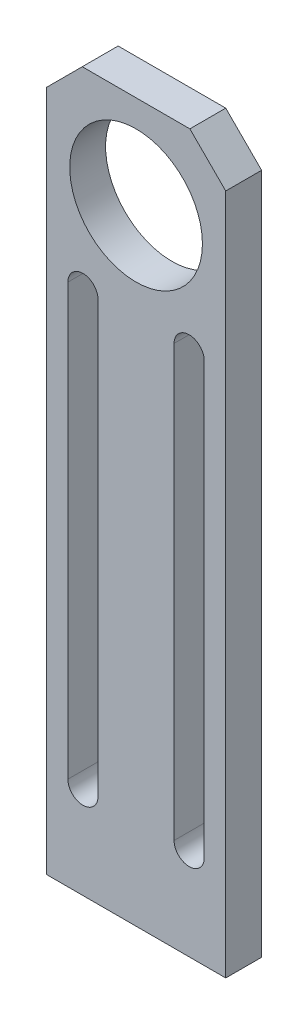
ISO-10303-21;
HEADER;
FILE_DESCRIPTION(('STEP AP214'),'2;1');
FILE_NAME('part.step','',(''),(''),'','','');
FILE_SCHEMA(('AUTOMOTIVE_DESIGN { 1 0 10303 214 1 1 1 1 }'));
ENDSEC;
DATA;
#1=APPLICATION_CONTEXT('core data for automotive mechanical design processes');
#2=APPLICATION_PROTOCOL_DEFINITION('international standard','automotive_design',2000,#1);
#3=PRODUCT_CONTEXT('',#1,'mechanical');
#4=PRODUCT('Part','Part','',(#3));
#5=PRODUCT_RELATED_PRODUCT_CATEGORY('part','',(#4));
#6=PRODUCT_DEFINITION_FORMATION('','',#4);
#7=PRODUCT_DEFINITION_CONTEXT('part definition',#1,'design');
#8=PRODUCT_DEFINITION('design','',#6,#7);
#9=PRODUCT_DEFINITION_SHAPE('','',#8);
#10=(LENGTH_UNIT() NAMED_UNIT(*) SI_UNIT(.MILLI.,.METRE.));
#11=(NAMED_UNIT(*) PLANE_ANGLE_UNIT() SI_UNIT($,.RADIAN.));
#12=(NAMED_UNIT(*) SI_UNIT($,.STERADIAN.) SOLID_ANGLE_UNIT());
#13=UNCERTAINTY_MEASURE_WITH_UNIT(LENGTH_MEASURE(1.E-05),#10,'distance_accuracy_value','');
#14=(GEOMETRIC_REPRESENTATION_CONTEXT(3) GLOBAL_UNCERTAINTY_ASSIGNED_CONTEXT((#13)) GLOBAL_UNIT_ASSIGNED_CONTEXT((#10,
#11,#12)) REPRESENTATION_CONTEXT('',''));
#15=CARTESIAN_POINT('',(0.,0.,0.));
#16=DIRECTION('',(0.,0.,1.));
#17=DIRECTION('',(1.,0.,0.));
#18=AXIS2_PLACEMENT_3D('',#15,#16,#17);
#19=CARTESIAN_POINT('',(0.,0.,2.5));
#20=DIRECTION('',(0.,0.,1.));
#21=DIRECTION('',(1.,0.,0.));
#22=AXIS2_PLACEMENT_3D('',#19,#20,#21);
#23=PLANE('',#22);
#24=DIRECTION('',(0.,1.,0.));
#25=VECTOR('',#24,1.);
#26=CARTESIAN_POINT('',(12.5,45.,2.5));
#27=LINE('',#26,#25);
#28=CARTESIAN_POINT('',(12.5,-50.,2.5));
#29=VERTEX_POINT('',#28);
#30=CARTESIAN_POINT('',(12.5,45.,2.5));
#31=VERTEX_POINT('',#30);
#32=EDGE_CURVE('E240',#29,#31,#27,.T.);
#33=ORIENTED_EDGE('',*,*,#32,.T.);
#34=DIRECTION('',(-0.707106781186548,0.707106781186547,0.));
#35=VECTOR('',#34,1.);
#36=CARTESIAN_POINT('',(7.49999999999999,50.,2.5));
#37=LINE('',#36,#35);
#38=CARTESIAN_POINT('',(7.49999999999999,50.,2.5));
#39=VERTEX_POINT('',#38);
#40=EDGE_CURVE('E244',#31,#39,#37,.T.);
#41=ORIENTED_EDGE('',*,*,#40,.T.);
#42=DIRECTION('',(-1.,0.,0.));
#43=VECTOR('',#42,1.);
#44=CARTESIAN_POINT('',(-7.50000000000001,50.,2.5));
#45=LINE('',#44,#43);
#46=CARTESIAN_POINT('',(-7.50000000000001,50.,2.5));
#47=VERTEX_POINT('',#46);
#48=EDGE_CURVE('E248',#39,#47,#45,.T.);
#49=ORIENTED_EDGE('',*,*,#48,.T.);
#50=DIRECTION('',(-0.707106781186548,-0.707106781186547,0.));
#51=VECTOR('',#50,1.);
#52=CARTESIAN_POINT('',(-12.5,45.,2.5));
#53=LINE('',#52,#51);
#54=CARTESIAN_POINT('',(-12.5,45.,2.5));
#55=VERTEX_POINT('',#54);
#56=EDGE_CURVE('E251',#47,#55,#53,.T.);
#57=ORIENTED_EDGE('',*,*,#56,.T.);
#58=DIRECTION('',(0.,-1.,0.));
#59=VECTOR('',#58,1.);
#60=CARTESIAN_POINT('',(-12.5,45.,2.5));
#61=LINE('',#60,#59);
#62=CARTESIAN_POINT('',(-12.5,-50.,2.5));
#63=VERTEX_POINT('',#62);
#64=EDGE_CURVE('E254',#55,#63,#61,.T.);
#65=ORIENTED_EDGE('',*,*,#64,.T.);
#66=DIRECTION('',(1.,0.,0.));
#67=VECTOR('',#66,1.);
#68=CARTESIAN_POINT('',(-12.5,-50.,2.5));
#69=LINE('',#68,#67);
#70=EDGE_CURVE('E257',#63,#29,#69,.T.);
#71=ORIENTED_EDGE('',*,*,#70,.T.);
#72=EDGE_LOOP('',(#33,#41,#49,#57,#65,#71));
#73=FACE_BOUND('',#72,.T.);
#74=CARTESIAN_POINT('',(0.,37.,2.5));
#75=DIRECTION('',(0.,0.,1.));
#76=DIRECTION('',(1.,0.,0.));
#77=AXIS2_PLACEMENT_3D('',#74,#75,#76);
#78=CIRCLE('',#77,9.25);
#79=CARTESIAN_POINT('',(9.25,37.,2.5));
#80=VERTEX_POINT('',#79);
#81=EDGE_CURVE('E232',#80,#80,#78,.T.);
#82=ORIENTED_EDGE('',*,*,#81,.F.);
#83=EDGE_LOOP('',(#82));
#84=FACE_BOUND('',#83,.T.);
#85=DIRECTION('',(0.,-1.,0.));
#86=VECTOR('',#85,1.);
#87=CARTESIAN_POINT('',(5.3,23.,2.5));
#88=LINE('',#87,#86);
#89=CARTESIAN_POINT('',(5.3,23.,2.5));
#90=VERTEX_POINT('',#89);
#91=CARTESIAN_POINT('',(5.30000000000003,-37.,2.5));
#92=VERTEX_POINT('',#91);
#93=EDGE_CURVE('E192',#90,#92,#88,.T.);
#94=ORIENTED_EDGE('',*,*,#93,.F.);
#95=CARTESIAN_POINT('',(7.40000000000001,23.,2.5));
#96=DIRECTION('',(0.,0.,1.));
#97=DIRECTION('',(1.,0.,0.));
#98=AXIS2_PLACEMENT_3D('',#95,#96,#97);
#99=CIRCLE('',#98,2.1);
#100=CARTESIAN_POINT('',(9.49999999999999,23.,2.5));
#101=VERTEX_POINT('',#100);
#102=EDGE_CURVE('E189',#101,#90,#99,.T.);
#103=ORIENTED_EDGE('',*,*,#102,.F.);
#104=DIRECTION('',(0.,1.,0.));
#105=VECTOR('',#104,1.);
#106=CARTESIAN_POINT('',(9.49999999999999,23.,2.5));
#107=LINE('',#106,#105);
#108=CARTESIAN_POINT('',(9.49999999999997,-37.,2.5));
#109=VERTEX_POINT('',#108);
#110=EDGE_CURVE('E200',#109,#101,#107,.T.);
#111=ORIENTED_EDGE('',*,*,#110,.F.);
#112=CARTESIAN_POINT('',(7.40000000000001,-37.,2.5));
#113=DIRECTION('',(0.,0.,1.));
#114=DIRECTION('',(1.,0.,0.));
#115=AXIS2_PLACEMENT_3D('',#112,#113,#114);
#116=CIRCLE('',#115,2.09999999999998);
#117=EDGE_CURVE('E196',#92,#109,#116,.T.);
#118=ORIENTED_EDGE('',*,*,#117,.F.);
#119=EDGE_LOOP('',(#94,#103,#111,#118));
#120=FACE_BOUND('',#119,.T.);
#121=DIRECTION('',(0.,-1.,0.));
#122=VECTOR('',#121,1.);
#123=CARTESIAN_POINT('',(-9.49999999999999,23.,2.5));
#124=LINE('',#123,#122);
#125=CARTESIAN_POINT('',(-9.49999999999999,23.,2.5));
#126=VERTEX_POINT('',#125);
#127=CARTESIAN_POINT('',(-9.49999999999996,-37.,2.5));
#128=VERTEX_POINT('',#127);
#129=EDGE_CURVE('E150',#126,#128,#124,.T.);
#130=ORIENTED_EDGE('',*,*,#129,.F.);
#131=CARTESIAN_POINT('',(-7.4,23.,2.5));
#132=DIRECTION('',(0.,0.,1.));
#133=DIRECTION('',(-1.,0.,0.));
#134=AXIS2_PLACEMENT_3D('',#131,#132,#133);
#135=CIRCLE('',#134,2.1);
#136=CARTESIAN_POINT('',(-5.29999999999999,23.,2.5));
#137=VERTEX_POINT('',#136);
#138=EDGE_CURVE('E141',#137,#126,#135,.T.);
#139=ORIENTED_EDGE('',*,*,#138,.F.);
#140=DIRECTION('',(0.,1.,0.));
#141=VECTOR('',#140,1.);
#142=CARTESIAN_POINT('',(-5.29999999999999,23.,2.5));
#143=LINE('',#142,#141);
#144=CARTESIAN_POINT('',(-5.3,-37.,2.5));
#145=VERTEX_POINT('',#144);
#146=EDGE_CURVE('E167',#145,#137,#143,.T.);
#147=ORIENTED_EDGE('',*,*,#146,.F.);
#148=CARTESIAN_POINT('',(-7.40000000000001,-37.,2.5));
#149=DIRECTION('',(0.,0.,1.));
#150=DIRECTION('',(-1.,0.,0.));
#151=AXIS2_PLACEMENT_3D('',#148,#149,#150);
#152=CIRCLE('',#151,2.09999999999998);
#153=EDGE_CURVE('E163',#128,#145,#152,.T.);
#154=ORIENTED_EDGE('',*,*,#153,.F.);
#155=EDGE_LOOP('',(#130,#139,#147,#154));
#156=FACE_BOUND('',#155,.T.);
#157=ADVANCED_FACE('F39',(#73,#84,#120,#156),#23,.T.);
#158=CARTESIAN_POINT('',(0.,0.,-2.5));
#159=DIRECTION('',(0.,0.,1.));
#160=DIRECTION('',(1.,0.,0.));
#161=AXIS2_PLACEMENT_3D('',#158,#159,#160);
#162=PLANE('',#161);
#163=CARTESIAN_POINT('',(7.40000000000001,23.,-2.5));
#164=DIRECTION('',(0.,0.,1.));
#165=DIRECTION('',(1.,0.,0.));
#166=AXIS2_PLACEMENT_3D('',#163,#164,#165);
#167=CIRCLE('',#166,2.1);
#168=CARTESIAN_POINT('',(9.49999999999999,23.,-2.5));
#169=VERTEX_POINT('',#168);
#170=CARTESIAN_POINT('',(5.3,23.,-2.5));
#171=VERTEX_POINT('',#170);
#172=EDGE_CURVE('E159',#169,#171,#167,.T.);
#173=ORIENTED_EDGE('',*,*,#172,.T.);
#174=DIRECTION('',(0.,-1.,0.));
#175=VECTOR('',#174,1.);
#176=CARTESIAN_POINT('',(5.3,23.,-2.5));
#177=LINE('',#176,#175);
#178=CARTESIAN_POINT('',(5.30000000000003,-37.,-2.5));
#179=VERTEX_POINT('',#178);
#180=EDGE_CURVE('E207',#171,#179,#177,.T.);
#181=ORIENTED_EDGE('',*,*,#180,.T.);
#182=CARTESIAN_POINT('',(7.40000000000001,-37.,-2.5));
#183=DIRECTION('',(0.,0.,1.));
#184=DIRECTION('',(1.,0.,0.));
#185=AXIS2_PLACEMENT_3D('',#182,#183,#184);
#186=CIRCLE('',#185,2.09999999999998);
#187=CARTESIAN_POINT('',(9.49999999999997,-37.,-2.5));
#188=VERTEX_POINT('',#187);
#189=EDGE_CURVE('E211',#179,#188,#186,.T.);
#190=ORIENTED_EDGE('',*,*,#189,.T.);
#191=DIRECTION('',(0.,1.,0.));
#192=VECTOR('',#191,1.);
#193=CARTESIAN_POINT('',(9.49999999999999,23.,-2.5));
#194=LINE('',#193,#192);
#195=EDGE_CURVE('E193',#188,#169,#194,.T.);
#196=ORIENTED_EDGE('',*,*,#195,.T.);
#197=EDGE_LOOP('',(#173,#181,#190,#196));
#198=FACE_BOUND('',#197,.T.);
#199=DIRECTION('',(0.,1.,0.));
#200=VECTOR('',#199,1.);
#201=CARTESIAN_POINT('',(12.5,45.,-2.5));
#202=LINE('',#201,#200);
#203=CARTESIAN_POINT('',(12.5,-50.,-2.5));
#204=VERTEX_POINT('',#203);
#205=CARTESIAN_POINT('',(12.5,45.,-2.5));
#206=VERTEX_POINT('',#205);
#207=EDGE_CURVE('E236',#204,#206,#202,.T.);
#208=ORIENTED_EDGE('',*,*,#207,.F.);
#209=DIRECTION('',(1.,0.,0.));
#210=VECTOR('',#209,1.);
#211=CARTESIAN_POINT('',(-12.5,-50.,-2.5));
#212=LINE('',#211,#210);
#213=CARTESIAN_POINT('',(-12.5,-50.,-2.5));
#214=VERTEX_POINT('',#213);
#215=EDGE_CURVE('E245',#214,#204,#212,.T.);
#216=ORIENTED_EDGE('',*,*,#215,.F.);
#217=DIRECTION('',(0.,-1.,0.));
#218=VECTOR('',#217,1.);
#219=CARTESIAN_POINT('',(-12.5,45.,-2.5));
#220=LINE('',#219,#218);
#221=CARTESIAN_POINT('',(-12.5,45.,-2.5));
#222=VERTEX_POINT('',#221);
#223=EDGE_CURVE('E273',#222,#214,#220,.T.);
#224=ORIENTED_EDGE('',*,*,#223,.F.);
#225=DIRECTION('',(-0.707106781186548,-0.707106781186547,0.));
#226=VECTOR('',#225,1.);
#227=CARTESIAN_POINT('',(-12.5,45.,-2.5));
#228=LINE('',#227,#226);
#229=CARTESIAN_POINT('',(-7.50000000000001,50.,-2.5));
#230=VERTEX_POINT('',#229);
#231=EDGE_CURVE('E270',#230,#222,#228,.T.);
#232=ORIENTED_EDGE('',*,*,#231,.F.);
#233=DIRECTION('',(-1.,0.,0.));
#234=VECTOR('',#233,1.);
#235=CARTESIAN_POINT('',(-7.50000000000001,50.,-2.5));
#236=LINE('',#235,#234);
#237=CARTESIAN_POINT('',(7.49999999999999,50.,-2.5));
#238=VERTEX_POINT('',#237);
#239=EDGE_CURVE('E267',#238,#230,#236,.T.);
#240=ORIENTED_EDGE('',*,*,#239,.F.);
#241=DIRECTION('',(-0.707106781186548,0.707106781186547,0.));
#242=VECTOR('',#241,1.);
#243=CARTESIAN_POINT('',(7.49999999999999,50.,-2.5));
#244=LINE('',#243,#242);
#245=EDGE_CURVE('E264',#206,#238,#244,.T.);
#246=ORIENTED_EDGE('',*,*,#245,.F.);
#247=EDGE_LOOP('',(#208,#216,#224,#232,#240,#246));
#248=FACE_BOUND('',#247,.T.);
#249=CARTESIAN_POINT('',(0.,37.,-2.5));
#250=DIRECTION('',(0.,0.,1.));
#251=DIRECTION('',(1.,0.,0.));
#252=AXIS2_PLACEMENT_3D('',#249,#250,#251);
#253=CIRCLE('',#252,9.25);
#254=CARTESIAN_POINT('',(9.25,37.,-2.5));
#255=VERTEX_POINT('',#254);
#256=EDGE_CURVE('E231',#255,#255,#253,.T.);
#257=ORIENTED_EDGE('',*,*,#256,.T.);
#258=EDGE_LOOP('',(#257));
#259=FACE_BOUND('',#258,.T.);
#260=CARTESIAN_POINT('',(-7.4,23.,-2.5));
#261=DIRECTION('',(0.,0.,1.));
#262=DIRECTION('',(-1.,0.,0.));
#263=AXIS2_PLACEMENT_3D('',#260,#261,#262);
#264=CIRCLE('',#263,2.1);
#265=CARTESIAN_POINT('',(-5.29999999999999,23.,-2.5));
#266=VERTEX_POINT('',#265);
#267=CARTESIAN_POINT('',(-9.49999999999999,23.,-2.5));
#268=VERTEX_POINT('',#267);
#269=EDGE_CURVE('E63',#266,#268,#264,.T.);
#270=ORIENTED_EDGE('',*,*,#269,.T.);
#271=DIRECTION('',(0.,-1.,0.));
#272=VECTOR('',#271,1.);
#273=CARTESIAN_POINT('',(-9.49999999999999,23.,-2.5));
#274=LINE('',#273,#272);
#275=CARTESIAN_POINT('',(-9.49999999999996,-37.,-2.5));
#276=VERTEX_POINT('',#275);
#277=EDGE_CURVE('E157',#268,#276,#274,.T.);
#278=ORIENTED_EDGE('',*,*,#277,.T.);
#279=CARTESIAN_POINT('',(-7.40000000000001,-37.,-2.5));
#280=DIRECTION('',(0.,0.,1.));
#281=DIRECTION('',(-1.,0.,0.));
#282=AXIS2_PLACEMENT_3D('',#279,#280,#281);
#283=CIRCLE('',#282,2.09999999999998);
#284=CARTESIAN_POINT('',(-5.30000000000003,-37.,-2.5));
#285=VERTEX_POINT('',#284);
#286=EDGE_CURVE('E176',#276,#285,#283,.T.);
#287=ORIENTED_EDGE('',*,*,#286,.T.);
#288=DIRECTION('',(0.,1.,0.));
#289=VECTOR('',#288,1.);
#290=CARTESIAN_POINT('',(-5.29999999999999,23.,-2.5));
#291=LINE('',#290,#289);
#292=EDGE_CURVE('E151',#285,#266,#291,.T.);
#293=ORIENTED_EDGE('',*,*,#292,.T.);
#294=EDGE_LOOP('',(#270,#278,#287,#293));
#295=FACE_BOUND('',#294,.T.);
#296=ADVANCED_FACE('F304',(#198,#248,#259,#295),#162,.F.);
#297=CARTESIAN_POINT('',(12.5,45.,2.5));
#298=DIRECTION('',(-1.,0.,0.));
#299=DIRECTION('',(0.,-1.,0.));
#300=AXIS2_PLACEMENT_3D('',#297,#298,#299);
#301=PLANE('',#300);
#302=ORIENTED_EDGE('',*,*,#207,.T.);
#303=DIRECTION('',(0.,0.,-1.));
#304=VECTOR('',#303,1.);
#305=CARTESIAN_POINT('',(12.5,45.,2.5));
#306=LINE('',#305,#304);
#307=EDGE_CURVE('E11',#31,#206,#306,.T.);
#308=ORIENTED_EDGE('',*,*,#307,.F.);
#309=ORIENTED_EDGE('',*,*,#32,.F.);
#310=DIRECTION('',(0.,0.,-1.));
#311=VECTOR('',#310,1.);
#312=CARTESIAN_POINT('',(12.5,-50.,2.5));
#313=LINE('',#312,#311);
#314=EDGE_CURVE('E260',#29,#204,#313,.T.);
#315=ORIENTED_EDGE('',*,*,#314,.T.);
#316=EDGE_LOOP('',(#302,#308,#309,#315));
#317=FACE_BOUND('',#316,.T.);
#318=ADVANCED_FACE('F41',(#317),#301,.F.);
#319=CARTESIAN_POINT('',(7.49999999999999,50.,2.5));
#320=DIRECTION('',(-0.707106781186547,-0.707106781186548,0.));
#321=DIRECTION('',(0.707106781186548,-0.707106781186547,0.));
#322=AXIS2_PLACEMENT_3D('',#319,#320,#321);
#323=PLANE('',#322);
#324=ORIENTED_EDGE('',*,*,#245,.T.);
#325=DIRECTION('',(0.,0.,-1.));
#326=VECTOR('',#325,1.);
#327=CARTESIAN_POINT('',(7.49999999999999,50.,2.5));
#328=LINE('',#327,#326);
#329=EDGE_CURVE('E48',#39,#238,#328,.T.);
#330=ORIENTED_EDGE('',*,*,#329,.F.);
#331=ORIENTED_EDGE('',*,*,#40,.F.);
#332=ORIENTED_EDGE('',*,*,#307,.T.);
#333=EDGE_LOOP('',(#324,#330,#331,#332));
#334=FACE_BOUND('',#333,.T.);
#335=ADVANCED_FACE('F322',(#334),#323,.F.);
#336=CARTESIAN_POINT('',(-7.50000000000001,50.,2.5));
#337=DIRECTION('',(0.,-1.,0.));
#338=DIRECTION('',(0.,0.,-1.));
#339=AXIS2_PLACEMENT_3D('',#336,#337,#338);
#340=PLANE('',#339);
#341=ORIENTED_EDGE('',*,*,#239,.T.);
#342=DIRECTION('',(0.,0.,-1.));
#343=VECTOR('',#342,1.);
#344=CARTESIAN_POINT('',(-7.50000000000001,50.,2.5));
#345=LINE('',#344,#343);
#346=EDGE_CURVE('E289',#47,#230,#345,.T.);
#347=ORIENTED_EDGE('',*,*,#346,.F.);
#348=ORIENTED_EDGE('',*,*,#48,.F.);
#349=ORIENTED_EDGE('',*,*,#329,.T.);
#350=EDGE_LOOP('',(#341,#347,#348,#349));
#351=FACE_BOUND('',#350,.T.);
#352=ADVANCED_FACE('F298',(#351),#340,.F.);
#353=CARTESIAN_POINT('',(-12.5,45.,2.5));
#354=DIRECTION('',(0.707106781186547,-0.707106781186548,0.));
#355=DIRECTION('',(0.707106781186548,0.707106781186547,0.));
#356=AXIS2_PLACEMENT_3D('',#353,#354,#355);
#357=PLANE('',#356);
#358=ORIENTED_EDGE('',*,*,#231,.T.);
#359=DIRECTION('',(0.,0.,-1.));
#360=VECTOR('',#359,1.);
#361=CARTESIAN_POINT('',(-12.5,45.,2.5));
#362=LINE('',#361,#360);
#363=EDGE_CURVE('E285',#55,#222,#362,.T.);
#364=ORIENTED_EDGE('',*,*,#363,.F.);
#365=ORIENTED_EDGE('',*,*,#56,.F.);
#366=ORIENTED_EDGE('',*,*,#346,.T.);
#367=EDGE_LOOP('',(#358,#364,#365,#366));
#368=FACE_BOUND('',#367,.T.);
#369=ADVANCED_FACE('F310',(#368),#357,.F.);
#370=CARTESIAN_POINT('',(-12.5,45.,2.5));
#371=DIRECTION('',(1.,0.,0.));
#372=DIRECTION('',(0.,1.,0.));
#373=AXIS2_PLACEMENT_3D('',#370,#371,#372);
#374=PLANE('',#373);
#375=ORIENTED_EDGE('',*,*,#223,.T.);
#376=DIRECTION('',(0.,0.,-1.));
#377=VECTOR('',#376,1.);
#378=CARTESIAN_POINT('',(-12.5,-50.,2.5));
#379=LINE('',#378,#377);
#380=EDGE_CURVE('E281',#63,#214,#379,.T.);
#381=ORIENTED_EDGE('',*,*,#380,.F.);
#382=ORIENTED_EDGE('',*,*,#64,.F.);
#383=ORIENTED_EDGE('',*,*,#363,.T.);
#384=EDGE_LOOP('',(#375,#381,#382,#383));
#385=FACE_BOUND('',#384,.T.);
#386=ADVANCED_FACE('F314',(#385),#374,.F.);
#387=CARTESIAN_POINT('',(-12.5,-50.,2.5));
#388=DIRECTION('',(0.,1.,0.));
#389=DIRECTION('',(0.,0.,1.));
#390=AXIS2_PLACEMENT_3D('',#387,#388,#389);
#391=PLANE('',#390);
#392=ORIENTED_EDGE('',*,*,#215,.T.);
#393=ORIENTED_EDGE('',*,*,#314,.F.);
#394=ORIENTED_EDGE('',*,*,#70,.F.);
#395=ORIENTED_EDGE('',*,*,#380,.T.);
#396=EDGE_LOOP('',(#392,#393,#394,#395));
#397=FACE_BOUND('',#396,.T.);
#398=ADVANCED_FACE('F325',(#397),#391,.F.);
#399=CARTESIAN_POINT('',(0.,37.,2.5));
#400=DIRECTION('',(0.,0.,-1.));
#401=DIRECTION('',(-1.,0.,0.));
#402=AXIS2_PLACEMENT_3D('',#399,#400,#401);
#403=CYLINDRICAL_SURFACE('',#402,9.25);
#404=ORIENTED_EDGE('',*,*,#81,.T.);
#405=EDGE_LOOP('',(#404));
#406=FACE_BOUND('',#405,.T.);
#407=ORIENTED_EDGE('',*,*,#256,.F.);
#408=EDGE_LOOP('',(#407));
#409=FACE_BOUND('',#408,.T.);
#410=ADVANCED_FACE('F327',(#406,#409),#403,.F.);
#411=CARTESIAN_POINT('',(7.40000000000001,23.,2.5));
#412=DIRECTION('',(0.,0.,-1.));
#413=DIRECTION('',(-1.,0.,0.));
#414=AXIS2_PLACEMENT_3D('',#411,#412,#413);
#415=CYLINDRICAL_SURFACE('',#414,2.1);
#416=ORIENTED_EDGE('',*,*,#172,.F.);
#417=DIRECTION('',(0.,0.,-1.));
#418=VECTOR('',#417,1.);
#419=CARTESIAN_POINT('',(9.49999999999999,23.,2.5));
#420=LINE('',#419,#418);
#421=EDGE_CURVE('E203',#101,#169,#420,.T.);
#422=ORIENTED_EDGE('',*,*,#421,.F.);
#423=ORIENTED_EDGE('',*,*,#102,.T.);
#424=DIRECTION('',(0.,0.,-1.));
#425=VECTOR('',#424,1.);
#426=CARTESIAN_POINT('',(5.3,23.,2.5));
#427=LINE('',#426,#425);
#428=EDGE_CURVE('E227',#90,#171,#427,.T.);
#429=ORIENTED_EDGE('',*,*,#428,.T.);
#430=EDGE_LOOP('',(#416,#422,#423,#429));
#431=FACE_BOUND('',#430,.T.);
#432=ADVANCED_FACE('F333',(#431),#415,.F.);
#433=CARTESIAN_POINT('',(5.3,23.,2.5));
#434=DIRECTION('',(1.,0.,0.));
#435=DIRECTION('',(0.,1.,0.));
#436=AXIS2_PLACEMENT_3D('',#433,#434,#435);
#437=PLANE('',#436);
#438=ORIENTED_EDGE('',*,*,#180,.F.);
#439=ORIENTED_EDGE('',*,*,#428,.F.);
#440=ORIENTED_EDGE('',*,*,#93,.T.);
#441=DIRECTION('',(0.,0.,-1.));
#442=VECTOR('',#441,1.);
#443=CARTESIAN_POINT('',(5.30000000000003,-37.,2.5));
#444=LINE('',#443,#442);
#445=EDGE_CURVE('E224',#92,#179,#444,.T.);
#446=ORIENTED_EDGE('',*,*,#445,.T.);
#447=EDGE_LOOP('',(#438,#439,#440,#446));
#448=FACE_BOUND('',#447,.T.);
#449=ADVANCED_FACE('F347',(#448),#437,.T.);
#450=CARTESIAN_POINT('',(7.40000000000001,-37.,2.5));
#451=DIRECTION('',(0.,0.,-1.));
#452=DIRECTION('',(-1.,0.,0.));
#453=AXIS2_PLACEMENT_3D('',#450,#451,#452);
#454=CYLINDRICAL_SURFACE('',#453,2.09999999999998);
#455=ORIENTED_EDGE('',*,*,#189,.F.);
#456=ORIENTED_EDGE('',*,*,#445,.F.);
#457=ORIENTED_EDGE('',*,*,#117,.T.);
#458=DIRECTION('',(0.,0.,-1.));
#459=VECTOR('',#458,1.);
#460=CARTESIAN_POINT('',(9.49999999999997,-37.,2.5));
#461=LINE('',#460,#459);
#462=EDGE_CURVE('E221',#109,#188,#461,.T.);
#463=ORIENTED_EDGE('',*,*,#462,.T.);
#464=EDGE_LOOP('',(#455,#456,#457,#463));
#465=FACE_BOUND('',#464,.T.);
#466=ADVANCED_FACE('F351',(#465),#454,.F.);
#467=CARTESIAN_POINT('',(9.49999999999999,23.,2.5));
#468=DIRECTION('',(-1.,0.,0.));
#469=DIRECTION('',(0.,-1.,0.));
#470=AXIS2_PLACEMENT_3D('',#467,#468,#469);
#471=PLANE('',#470);
#472=ORIENTED_EDGE('',*,*,#195,.F.);
#473=ORIENTED_EDGE('',*,*,#462,.F.);
#474=ORIENTED_EDGE('',*,*,#110,.T.);
#475=ORIENTED_EDGE('',*,*,#421,.T.);
#476=EDGE_LOOP('',(#472,#473,#474,#475));
#477=FACE_BOUND('',#476,.T.);
#478=ADVANCED_FACE('F355',(#477),#471,.T.);
#479=CARTESIAN_POINT('',(-7.4,23.,2.5));
#480=DIRECTION('',(0.,0.,-1.));
#481=DIRECTION('',(-1.,0.,0.));
#482=AXIS2_PLACEMENT_3D('',#479,#480,#481);
#483=CYLINDRICAL_SURFACE('',#482,2.1);
#484=ORIENTED_EDGE('',*,*,#269,.F.);
#485=DIRECTION('',(0.,0.,-1.));
#486=VECTOR('',#485,1.);
#487=CARTESIAN_POINT('',(-5.29999999999999,23.,2.5));
#488=LINE('',#487,#486);
#489=EDGE_CURVE('E145',#137,#266,#488,.T.);
#490=ORIENTED_EDGE('',*,*,#489,.F.);
#491=ORIENTED_EDGE('',*,*,#138,.T.);
#492=DIRECTION('',(0.,0.,-1.));
#493=VECTOR('',#492,1.);
#494=CARTESIAN_POINT('',(-9.49999999999999,23.,2.5));
#495=LINE('',#494,#493);
#496=EDGE_CURVE('E144',#126,#268,#495,.T.);
#497=ORIENTED_EDGE('',*,*,#496,.T.);
#498=EDGE_LOOP('',(#484,#490,#491,#497));
#499=FACE_BOUND('',#498,.T.);
#500=ADVANCED_FACE('F143',(#499),#483,.F.);
#501=CARTESIAN_POINT('',(-9.49999999999999,23.,2.5));
#502=DIRECTION('',(1.,0.,0.));
#503=DIRECTION('',(0.,1.,0.));
#504=AXIS2_PLACEMENT_3D('',#501,#502,#503);
#505=PLANE('',#504);
#506=ORIENTED_EDGE('',*,*,#277,.F.);
#507=ORIENTED_EDGE('',*,*,#496,.F.);
#508=ORIENTED_EDGE('',*,*,#129,.T.);
#509=DIRECTION('',(0.,0.,-1.));
#510=VECTOR('',#509,1.);
#511=CARTESIAN_POINT('',(-9.49999999999996,-37.,2.5));
#512=LINE('',#511,#510);
#513=EDGE_CURVE('E160',#128,#276,#512,.T.);
#514=ORIENTED_EDGE('',*,*,#513,.T.);
#515=EDGE_LOOP('',(#506,#507,#508,#514));
#516=FACE_BOUND('',#515,.T.);
#517=ADVANCED_FACE('F154',(#516),#505,.T.);
#518=CARTESIAN_POINT('',(-7.40000000000001,-37.,2.5));
#519=DIRECTION('',(0.,0.,-1.));
#520=DIRECTION('',(-1.,0.,0.));
#521=AXIS2_PLACEMENT_3D('',#518,#519,#520);
#522=CYLINDRICAL_SURFACE('',#521,2.09999999999998);
#523=ORIENTED_EDGE('',*,*,#286,.F.);
#524=ORIENTED_EDGE('',*,*,#513,.F.);
#525=ORIENTED_EDGE('',*,*,#153,.T.);
#526=DIRECTION('',(0.,0.,-1.));
#527=VECTOR('',#526,1.);
#528=CARTESIAN_POINT('',(-5.30000000000003,-37.,2.5));
#529=LINE('',#528,#527);
#530=EDGE_CURVE('E55',#145,#285,#529,.T.);
#531=ORIENTED_EDGE('',*,*,#530,.T.);
#532=EDGE_LOOP('',(#523,#524,#525,#531));
#533=FACE_BOUND('',#532,.T.);
#534=ADVANCED_FACE('F364',(#533),#522,.F.);
#535=CARTESIAN_POINT('',(-5.29999999999999,23.,2.5));
#536=DIRECTION('',(-1.,0.,0.));
#537=DIRECTION('',(0.,-1.,0.));
#538=AXIS2_PLACEMENT_3D('',#535,#536,#537);
#539=PLANE('',#538);
#540=ORIENTED_EDGE('',*,*,#292,.F.);
#541=ORIENTED_EDGE('',*,*,#530,.F.);
#542=ORIENTED_EDGE('',*,*,#146,.T.);
#543=ORIENTED_EDGE('',*,*,#489,.T.);
#544=EDGE_LOOP('',(#540,#541,#542,#543));
#545=FACE_BOUND('',#544,.T.);
#546=ADVANCED_FACE('F367',(#545),#539,.T.);
#547=CLOSED_SHELL('',(#157,#296,#318,#335,#352,#369,#386,#398,#410,#432,#449,#466,#478,#500,
#517,#534,#546));
#548=MANIFOLD_SOLID_BREP('B2',#547);
#549=ADVANCED_BREP_SHAPE_REPRESENTATION('',(#18,#548),#14);
#550=SHAPE_DEFINITION_REPRESENTATION(#9,#549);
ENDSEC;
END-ISO-10303-21;
